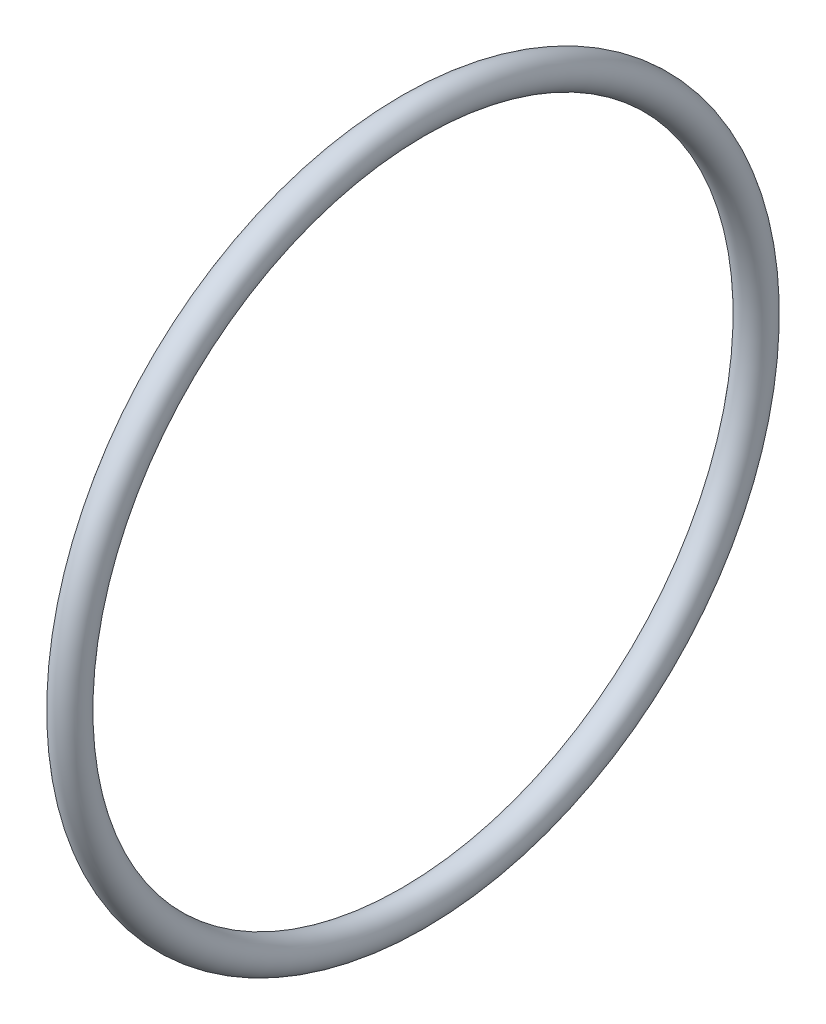
ISO-10303-21;
HEADER;
FILE_DESCRIPTION(('STEP AP214'),'2;1');
FILE_NAME('part.step','',(''),(''),'','','');
FILE_SCHEMA(('AUTOMOTIVE_DESIGN { 1 0 10303 214 1 1 1 1 }'));
ENDSEC;
DATA;
#1=APPLICATION_CONTEXT('core data for automotive mechanical design processes');
#2=APPLICATION_PROTOCOL_DEFINITION('international standard','automotive_design',2000,#1);
#3=PRODUCT_CONTEXT('',#1,'mechanical');
#4=PRODUCT('Part','Part','',(#3));
#5=PRODUCT_RELATED_PRODUCT_CATEGORY('part','',(#4));
#6=PRODUCT_DEFINITION_FORMATION('','',#4);
#7=PRODUCT_DEFINITION_CONTEXT('part definition',#1,'design');
#8=PRODUCT_DEFINITION('design','',#6,#7);
#9=PRODUCT_DEFINITION_SHAPE('','',#8);
#10=(LENGTH_UNIT() NAMED_UNIT(*) SI_UNIT(.MILLI.,.METRE.));
#11=(NAMED_UNIT(*) PLANE_ANGLE_UNIT() SI_UNIT($,.RADIAN.));
#12=(NAMED_UNIT(*) SI_UNIT($,.STERADIAN.) SOLID_ANGLE_UNIT());
#13=UNCERTAINTY_MEASURE_WITH_UNIT(LENGTH_MEASURE(1.E-05),#10,'distance_accuracy_value','');
#14=(GEOMETRIC_REPRESENTATION_CONTEXT(3) GLOBAL_UNCERTAINTY_ASSIGNED_CONTEXT((#13)) GLOBAL_UNIT_ASSIGNED_CONTEXT((#10,
#11,#12)) REPRESENTATION_CONTEXT('',''));
#15=CARTESIAN_POINT('',(0.,0.,0.));
#16=DIRECTION('',(0.,0.,1.));
#17=DIRECTION('',(1.,0.,0.));
#18=AXIS2_PLACEMENT_3D('',#15,#16,#17);
#19=CARTESIAN_POINT('',(0.,0.,0.));
#20=DIRECTION('',(1.,0.,0.));
#21=DIRECTION('',(0.,0.,1.));
#22=AXIS2_PLACEMENT_3D('',#19,#20,#21);
#23=TOROIDAL_SURFACE('',#22,21.,1.);
#24=CARTESIAN_POINT('',(0.,21.,0.));
#25=DIRECTION('',(0.,0.,1.));
#26=DIRECTION('',(1.,0.,0.));
#27=AXIS2_PLACEMENT_3D('',#24,#25,#26);
#28=CIRCLE('',#27,1.);
#29=CARTESIAN_POINT('',(0.,22.,0.));
#30=VERTEX_POINT('',#29);
#31=EDGE_CURVE('E10',#30,#30,#28,.T.);
#32=CARTESIAN_POINT('',(0.,0.,0.));
#33=DIRECTION('',(1.,0.,0.));
#34=DIRECTION('',(0.,0.,1.));
#35=AXIS2_PLACEMENT_3D('',#32,#33,#34);
#36=CIRCLE('',#35,22.);
#37=EDGE_CURVE('',#30,#30,#36,.T.);
#38=ORIENTED_EDGE('',*,*,#31,.T.);
#39=ORIENTED_EDGE('',*,*,#31,.F.);
#40=ORIENTED_EDGE('',*,*,#37,.T.);
#41=ORIENTED_EDGE('',*,*,#37,.F.);
#42=EDGE_LOOP('',(#38,#40,#39,#41));
#43=FACE_BOUND('',#42,.T.);
#44=ADVANCED_FACE('F32',(#43),#23,.T.);
#45=CLOSED_SHELL('',(#44));
#46=MANIFOLD_SOLID_BREP('B2',#45);
#47=ADVANCED_BREP_SHAPE_REPRESENTATION('',(#18,#46),#14);
#48=SHAPE_DEFINITION_REPRESENTATION(#9,#47);
ENDSEC;
END-ISO-10303-21;
